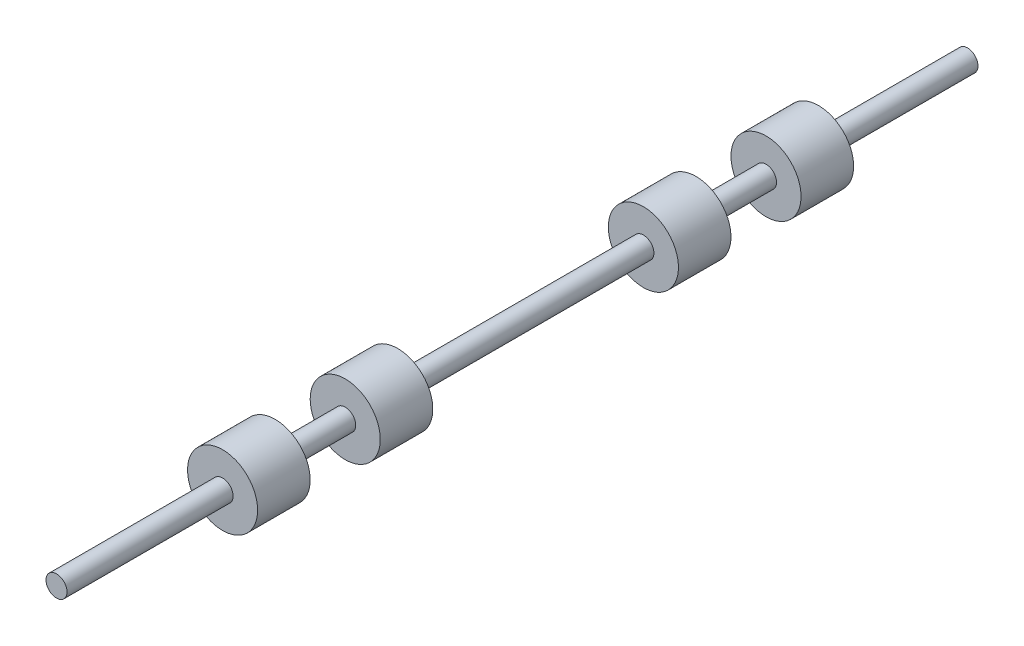
ISO-10303-21;
HEADER;
FILE_DESCRIPTION(('STEP AP214'),'2;1');
FILE_NAME('part.step','',(''),(''),'','','');
FILE_SCHEMA(('AUTOMOTIVE_DESIGN { 1 0 10303 214 1 1 1 1 }'));
ENDSEC;
DATA;
#1=APPLICATION_CONTEXT('core data for automotive mechanical design processes');
#2=APPLICATION_PROTOCOL_DEFINITION('international standard','automotive_design',2000,#1);
#3=PRODUCT_CONTEXT('',#1,'mechanical');
#4=PRODUCT('Part','Part','',(#3));
#5=PRODUCT_RELATED_PRODUCT_CATEGORY('part','',(#4));
#6=PRODUCT_DEFINITION_FORMATION('','',#4);
#7=PRODUCT_DEFINITION_CONTEXT('part definition',#1,'design');
#8=PRODUCT_DEFINITION('design','',#6,#7);
#9=PRODUCT_DEFINITION_SHAPE('','',#8);
#10=(LENGTH_UNIT() NAMED_UNIT(*) SI_UNIT(.MILLI.,.METRE.));
#11=(NAMED_UNIT(*) PLANE_ANGLE_UNIT() SI_UNIT($,.RADIAN.));
#12=(NAMED_UNIT(*) SI_UNIT($,.STERADIAN.) SOLID_ANGLE_UNIT());
#13=UNCERTAINTY_MEASURE_WITH_UNIT(LENGTH_MEASURE(1.E-05),#10,'distance_accuracy_value','');
#14=(GEOMETRIC_REPRESENTATION_CONTEXT(3) GLOBAL_UNCERTAINTY_ASSIGNED_CONTEXT((#13)) GLOBAL_UNIT_ASSIGNED_CONTEXT((#10,
#11,#12)) REPRESENTATION_CONTEXT('',''));
#15=CARTESIAN_POINT('',(0.,0.,0.));
#16=DIRECTION('',(0.,0.,1.));
#17=DIRECTION('',(1.,0.,0.));
#18=AXIS2_PLACEMENT_3D('',#15,#16,#17);
#19=CARTESIAN_POINT('',(0.,0.,26.));
#20=DIRECTION('',(0.,0.,-1.));
#21=DIRECTION('',(-1.,0.,0.));
#22=AXIS2_PLACEMENT_3D('',#19,#20,#21);
#23=CYLINDRICAL_SURFACE('',#22,0.3);
#24=CARTESIAN_POINT('',(0.,0.,17.76));
#25=DIRECTION('',(0.,0.,-1.));
#26=DIRECTION('',(-1.,0.,0.));
#27=AXIS2_PLACEMENT_3D('',#24,#25,#26);
#28=CIRCLE('',#27,0.3);
#29=CARTESIAN_POINT('',(-0.3,0.,17.76));
#30=VERTEX_POINT('',#29);
#31=EDGE_CURVE('E44',#30,#30,#28,.T.);
#32=ORIENTED_EDGE('',*,*,#31,.F.);
#33=EDGE_LOOP('',(#32));
#34=FACE_BOUND('',#33,.T.);
#35=CARTESIAN_POINT('',(0.,0.,19.76));
#36=DIRECTION('',(0.,0.,1.));
#37=DIRECTION('',(1.,0.,0.));
#38=AXIS2_PLACEMENT_3D('',#35,#36,#37);
#39=CIRCLE('',#38,0.3);
#40=CARTESIAN_POINT('',(0.3,0.,19.76));
#41=VERTEX_POINT('',#40);
#42=EDGE_CURVE('E40',#41,#41,#39,.T.);
#43=ORIENTED_EDGE('',*,*,#42,.F.);
#44=EDGE_LOOP('',(#43));
#45=FACE_BOUND('',#44,.T.);
#46=ADVANCED_FACE('F33',(#34,#45),#23,.T.);
#47=CARTESIAN_POINT('',(0.,0.,9.25));
#48=DIRECTION('',(0.,0.,-1.));
#49=DIRECTION('',(-1.,0.,0.));
#50=AXIS2_PLACEMENT_3D('',#47,#48,#49);
#51=CIRCLE('',#50,0.3);
#52=CARTESIAN_POINT('',(-0.3,0.,9.25));
#53=VERTEX_POINT('',#52);
#54=EDGE_CURVE('E53',#53,#53,#51,.T.);
#55=ORIENTED_EDGE('',*,*,#54,.F.);
#56=EDGE_LOOP('',(#55));
#57=FACE_BOUND('',#56,.T.);
#58=CARTESIAN_POINT('',(0.,0.,16.26));
#59=DIRECTION('',(0.,0.,1.));
#60=DIRECTION('',(1.,0.,0.));
#61=AXIS2_PLACEMENT_3D('',#58,#59,#60);
#62=CIRCLE('',#61,0.3);
#63=CARTESIAN_POINT('',(0.3,0.,16.26));
#64=VERTEX_POINT('',#63);
#65=EDGE_CURVE('E48',#64,#64,#62,.T.);
#66=ORIENTED_EDGE('',*,*,#65,.F.);
#67=EDGE_LOOP('',(#66));
#68=FACE_BOUND('',#67,.T.);
#69=ADVANCED_FACE('F115',(#57,#68),#23,.T.);
#70=CARTESIAN_POINT('',(0.,0.,5.75));
#71=DIRECTION('',(0.,0.,-1.));
#72=DIRECTION('',(-1.,0.,0.));
#73=AXIS2_PLACEMENT_3D('',#70,#71,#72);
#74=CIRCLE('',#73,0.3);
#75=CARTESIAN_POINT('',(-0.3,0.,5.75));
#76=VERTEX_POINT('',#75);
#77=EDGE_CURVE('E59',#76,#76,#74,.T.);
#78=ORIENTED_EDGE('',*,*,#77,.F.);
#79=EDGE_LOOP('',(#78));
#80=FACE_BOUND('',#79,.T.);
#81=CARTESIAN_POINT('',(0.,0.,7.75));
#82=DIRECTION('',(0.,0.,1.));
#83=DIRECTION('',(1.,0.,0.));
#84=AXIS2_PLACEMENT_3D('',#81,#82,#83);
#85=CIRCLE('',#84,0.3);
#86=CARTESIAN_POINT('',(0.3,0.,7.75));
#87=VERTEX_POINT('',#86);
#88=EDGE_CURVE('E56',#87,#87,#85,.T.);
#89=ORIENTED_EDGE('',*,*,#88,.F.);
#90=EDGE_LOOP('',(#89));
#91=FACE_BOUND('',#90,.T.);
#92=ADVANCED_FACE('F120',(#80,#91),#23,.T.);
#93=CARTESIAN_POINT('',(0.,0.,5.75));
#94=DIRECTION('',(0.,0.,-1.));
#95=DIRECTION('',(-1.,0.,0.));
#96=AXIS2_PLACEMENT_3D('',#93,#94,#95);
#97=PLANE('',#96);
#98=ORIENTED_EDGE('',*,*,#77,.T.);
#99=EDGE_LOOP('',(#98));
#100=FACE_BOUND('',#99,.T.);
#101=CARTESIAN_POINT('',(0.,0.,5.75));
#102=DIRECTION('',(0.,0.,-1.));
#103=DIRECTION('',(-1.,0.,0.));
#104=AXIS2_PLACEMENT_3D('',#101,#102,#103);
#105=CIRCLE('',#104,1.);
#106=CARTESIAN_POINT('',(-1.,0.,5.75));
#107=VERTEX_POINT('',#106);
#108=EDGE_CURVE('E69',#107,#107,#105,.T.);
#109=ORIENTED_EDGE('',*,*,#108,.F.);
#110=EDGE_LOOP('',(#109));
#111=FACE_BOUND('',#110,.T.);
#112=ADVANCED_FACE('F150',(#100,#111),#97,.F.);
#113=CARTESIAN_POINT('',(0.,0.,-1.24955045451801));
#114=DIRECTION('',(0.,0.,-1.));
#115=DIRECTION('',(-1.,0.,0.));
#116=AXIS2_PLACEMENT_3D('',#113,#114,#115);
#117=CYLINDRICAL_SURFACE('',#116,1.);
#118=CARTESIAN_POINT('',(0.,0.,4.25));
#119=DIRECTION('',(0.,0.,-1.));
#120=DIRECTION('',(-1.,0.,0.));
#121=AXIS2_PLACEMENT_3D('',#118,#119,#120);
#122=CIRCLE('',#121,1.);
#123=CARTESIAN_POINT('',(-1.,0.,4.25));
#124=VERTEX_POINT('',#123);
#125=EDGE_CURVE('E74',#124,#124,#122,.T.);
#126=ORIENTED_EDGE('',*,*,#125,.F.);
#127=EDGE_LOOP('',(#126));
#128=FACE_BOUND('',#127,.T.);
#129=ORIENTED_EDGE('',*,*,#108,.T.);
#130=EDGE_LOOP('',(#129));
#131=FACE_BOUND('',#130,.T.);
#132=ADVANCED_FACE('F155',(#128,#131),#117,.T.);
#133=CARTESIAN_POINT('',(0.,0.,4.25));
#134=DIRECTION('',(0.,0.,1.));
#135=DIRECTION('',(1.,0.,0.));
#136=AXIS2_PLACEMENT_3D('',#133,#134,#135);
#137=PLANE('',#136);
#138=CARTESIAN_POINT('',(0.,0.,4.25));
#139=DIRECTION('',(0.,0.,1.));
#140=DIRECTION('',(1.,0.,0.));
#141=AXIS2_PLACEMENT_3D('',#138,#139,#140);
#142=CIRCLE('',#141,0.3);
#143=CARTESIAN_POINT('',(0.3,0.,4.25));
#144=VERTEX_POINT('',#143);
#145=EDGE_CURVE('E62',#144,#144,#142,.T.);
#146=ORIENTED_EDGE('',*,*,#145,.T.);
#147=EDGE_LOOP('',(#146));
#148=FACE_BOUND('',#147,.T.);
#149=ORIENTED_EDGE('',*,*,#125,.T.);
#150=EDGE_LOOP('',(#149));
#151=FACE_BOUND('',#150,.T.);
#152=ADVANCED_FACE('F146',(#148,#151),#137,.F.);
#153=CARTESIAN_POINT('',(0.,0.,0.));
#154=DIRECTION('',(0.,0.,1.));
#155=DIRECTION('',(1.,0.,0.));
#156=AXIS2_PLACEMENT_3D('',#153,#154,#155);
#157=PLANE('',#156);
#158=CARTESIAN_POINT('',(0.,0.,0.));
#159=DIRECTION('',(0.,0.,1.));
#160=DIRECTION('',(1.,0.,0.));
#161=AXIS2_PLACEMENT_3D('',#158,#159,#160);
#162=CIRCLE('',#161,0.3);
#163=CARTESIAN_POINT('',(0.3,0.,0.));
#164=VERTEX_POINT('',#163);
#165=EDGE_CURVE('E66',#164,#164,#162,.T.);
#166=ORIENTED_EDGE('',*,*,#165,.F.);
#167=EDGE_LOOP('',(#166));
#168=FACE_BOUND('',#167,.T.);
#169=ADVANCED_FACE('F137',(#168),#157,.F.);
#170=ORIENTED_EDGE('',*,*,#165,.T.);
#171=EDGE_LOOP('',(#170));
#172=FACE_BOUND('',#171,.T.);
#173=ORIENTED_EDGE('',*,*,#145,.F.);
#174=EDGE_LOOP('',(#173));
#175=FACE_BOUND('',#174,.T.);
#176=ADVANCED_FACE('F127',(#172,#175),#23,.T.);
#177=CARTESIAN_POINT('',(0.,0.,9.25));
#178=DIRECTION('',(0.,0.,-1.));
#179=DIRECTION('',(-1.,0.,0.));
#180=AXIS2_PLACEMENT_3D('',#177,#178,#179);
#181=PLANE('',#180);
#182=ORIENTED_EDGE('',*,*,#54,.T.);
#183=EDGE_LOOP('',(#182));
#184=FACE_BOUND('',#183,.T.);
#185=CARTESIAN_POINT('',(0.,0.,9.25));
#186=DIRECTION('',(0.,0.,-1.));
#187=DIRECTION('',(-1.,0.,0.));
#188=AXIS2_PLACEMENT_3D('',#185,#186,#187);
#189=CIRCLE('',#188,1.);
#190=CARTESIAN_POINT('',(-1.,0.,9.25));
#191=VERTEX_POINT('',#190);
#192=EDGE_CURVE('E77',#191,#191,#189,.T.);
#193=ORIENTED_EDGE('',*,*,#192,.F.);
#194=EDGE_LOOP('',(#193));
#195=FACE_BOUND('',#194,.T.);
#196=ADVANCED_FACE('F136',(#184,#195),#181,.F.);
#197=CARTESIAN_POINT('',(0.,0.,-1.24955045451801));
#198=DIRECTION('',(0.,0.,-1.));
#199=DIRECTION('',(-1.,0.,0.));
#200=AXIS2_PLACEMENT_3D('',#197,#198,#199);
#201=CYLINDRICAL_SURFACE('',#200,1.);
#202=CARTESIAN_POINT('',(0.,0.,7.75));
#203=DIRECTION('',(0.,0.,-1.));
#204=DIRECTION('',(-1.,0.,0.));
#205=AXIS2_PLACEMENT_3D('',#202,#203,#204);
#206=CIRCLE('',#205,1.);
#207=CARTESIAN_POINT('',(-1.,0.,7.75));
#208=VERTEX_POINT('',#207);
#209=EDGE_CURVE('E80',#208,#208,#206,.T.);
#210=ORIENTED_EDGE('',*,*,#209,.F.);
#211=EDGE_LOOP('',(#210));
#212=FACE_BOUND('',#211,.T.);
#213=ORIENTED_EDGE('',*,*,#192,.T.);
#214=EDGE_LOOP('',(#213));
#215=FACE_BOUND('',#214,.T.);
#216=ADVANCED_FACE('F143',(#212,#215),#201,.T.);
#217=CARTESIAN_POINT('',(0.,0.,7.75));
#218=DIRECTION('',(0.,0.,1.));
#219=DIRECTION('',(1.,0.,0.));
#220=AXIS2_PLACEMENT_3D('',#217,#218,#219);
#221=PLANE('',#220);
#222=ORIENTED_EDGE('',*,*,#88,.T.);
#223=EDGE_LOOP('',(#222));
#224=FACE_BOUND('',#223,.T.);
#225=ORIENTED_EDGE('',*,*,#209,.T.);
#226=EDGE_LOOP('',(#225));
#227=FACE_BOUND('',#226,.T.);
#228=ADVANCED_FACE('F162',(#224,#227),#221,.F.);
#229=CARTESIAN_POINT('',(0.,0.,17.76));
#230=DIRECTION('',(0.,0.,-1.));
#231=DIRECTION('',(-1.,0.,0.));
#232=AXIS2_PLACEMENT_3D('',#229,#230,#231);
#233=PLANE('',#232);
#234=ORIENTED_EDGE('',*,*,#31,.T.);
#235=EDGE_LOOP('',(#234));
#236=FACE_BOUND('',#235,.T.);
#237=CARTESIAN_POINT('',(0.,0.,17.76));
#238=DIRECTION('',(0.,0.,-1.));
#239=DIRECTION('',(-1.,0.,0.));
#240=AXIS2_PLACEMENT_3D('',#237,#238,#239);
#241=CIRCLE('',#240,1.);
#242=CARTESIAN_POINT('',(-1.,0.,17.76));
#243=VERTEX_POINT('',#242);
#244=EDGE_CURVE('E83',#243,#243,#241,.T.);
#245=ORIENTED_EDGE('',*,*,#244,.F.);
#246=EDGE_LOOP('',(#245));
#247=FACE_BOUND('',#246,.T.);
#248=ADVANCED_FACE('F165',(#236,#247),#233,.F.);
#249=CARTESIAN_POINT('',(0.,0.,-1.24955045451801));
#250=DIRECTION('',(0.,0.,-1.));
#251=DIRECTION('',(-1.,0.,0.));
#252=AXIS2_PLACEMENT_3D('',#249,#250,#251);
#253=CYLINDRICAL_SURFACE('',#252,1.);
#254=CARTESIAN_POINT('',(0.,0.,16.26));
#255=DIRECTION('',(0.,0.,-1.));
#256=DIRECTION('',(-1.,0.,0.));
#257=AXIS2_PLACEMENT_3D('',#254,#255,#256);
#258=CIRCLE('',#257,1.);
#259=CARTESIAN_POINT('',(-1.,0.,16.26));
#260=VERTEX_POINT('',#259);
#261=EDGE_CURVE('E86',#260,#260,#258,.T.);
#262=ORIENTED_EDGE('',*,*,#261,.F.);
#263=EDGE_LOOP('',(#262));
#264=FACE_BOUND('',#263,.T.);
#265=ORIENTED_EDGE('',*,*,#244,.T.);
#266=EDGE_LOOP('',(#265));
#267=FACE_BOUND('',#266,.T.);
#268=ADVANCED_FACE('F111',(#264,#267),#253,.T.);
#269=CARTESIAN_POINT('',(0.,0.,16.26));
#270=DIRECTION('',(0.,0.,1.));
#271=DIRECTION('',(1.,0.,0.));
#272=AXIS2_PLACEMENT_3D('',#269,#270,#271);
#273=PLANE('',#272);
#274=ORIENTED_EDGE('',*,*,#65,.T.);
#275=EDGE_LOOP('',(#274));
#276=FACE_BOUND('',#275,.T.);
#277=ORIENTED_EDGE('',*,*,#261,.T.);
#278=EDGE_LOOP('',(#277));
#279=FACE_BOUND('',#278,.T.);
#280=ADVANCED_FACE('F106',(#276,#279),#273,.F.);
#281=CARTESIAN_POINT('',(0.,0.,21.26));
#282=DIRECTION('',(0.,0.,-1.));
#283=DIRECTION('',(-1.,0.,0.));
#284=AXIS2_PLACEMENT_3D('',#281,#282,#283);
#285=PLANE('',#284);
#286=CARTESIAN_POINT('',(0.,0.,21.26));
#287=DIRECTION('',(0.,0.,-1.));
#288=DIRECTION('',(-1.,0.,0.));
#289=AXIS2_PLACEMENT_3D('',#286,#287,#288);
#290=CIRCLE('',#289,0.3);
#291=CARTESIAN_POINT('',(-0.3,0.,21.26));
#292=VERTEX_POINT('',#291);
#293=EDGE_CURVE('E10',#292,#292,#290,.T.);
#294=ORIENTED_EDGE('',*,*,#293,.T.);
#295=EDGE_LOOP('',(#294));
#296=FACE_BOUND('',#295,.T.);
#297=CARTESIAN_POINT('',(0.,0.,21.26));
#298=DIRECTION('',(0.,0.,-1.));
#299=DIRECTION('',(-1.,0.,0.));
#300=AXIS2_PLACEMENT_3D('',#297,#298,#299);
#301=CIRCLE('',#300,1.);
#302=CARTESIAN_POINT('',(-1.,0.,21.26));
#303=VERTEX_POINT('',#302);
#304=EDGE_CURVE('E89',#303,#303,#301,.T.);
#305=ORIENTED_EDGE('',*,*,#304,.F.);
#306=EDGE_LOOP('',(#305));
#307=FACE_BOUND('',#306,.T.);
#308=ADVANCED_FACE('F101',(#296,#307),#285,.F.);
#309=CARTESIAN_POINT('',(0.,0.,-1.24955045451801));
#310=DIRECTION('',(0.,0.,-1.));
#311=DIRECTION('',(-1.,0.,0.));
#312=AXIS2_PLACEMENT_3D('',#309,#310,#311);
#313=CYLINDRICAL_SURFACE('',#312,1.);
#314=CARTESIAN_POINT('',(0.,0.,19.76));
#315=DIRECTION('',(0.,0.,-1.));
#316=DIRECTION('',(-1.,0.,0.));
#317=AXIS2_PLACEMENT_3D('',#314,#315,#316);
#318=CIRCLE('',#317,1.);
#319=CARTESIAN_POINT('',(-1.,0.,19.76));
#320=VERTEX_POINT('',#319);
#321=EDGE_CURVE('E92',#320,#320,#318,.T.);
#322=ORIENTED_EDGE('',*,*,#321,.F.);
#323=EDGE_LOOP('',(#322));
#324=FACE_BOUND('',#323,.T.);
#325=ORIENTED_EDGE('',*,*,#304,.T.);
#326=EDGE_LOOP('',(#325));
#327=FACE_BOUND('',#326,.T.);
#328=ADVANCED_FACE('F98',(#324,#327),#313,.T.);
#329=CARTESIAN_POINT('',(0.,0.,19.76));
#330=DIRECTION('',(0.,0.,1.));
#331=DIRECTION('',(1.,0.,0.));
#332=AXIS2_PLACEMENT_3D('',#329,#330,#331);
#333=PLANE('',#332);
#334=ORIENTED_EDGE('',*,*,#42,.T.);
#335=EDGE_LOOP('',(#334));
#336=FACE_BOUND('',#335,.T.);
#337=ORIENTED_EDGE('',*,*,#321,.T.);
#338=EDGE_LOOP('',(#337));
#339=FACE_BOUND('',#338,.T.);
#340=ADVANCED_FACE('F96',(#336,#339),#333,.F.);
#341=CARTESIAN_POINT('',(0.,0.,26.));
#342=DIRECTION('',(0.,0.,1.));
#343=DIRECTION('',(1.,0.,0.));
#344=AXIS2_PLACEMENT_3D('',#341,#342,#343);
#345=PLANE('',#344);
#346=CARTESIAN_POINT('',(0.,0.,26.));
#347=DIRECTION('',(0.,0.,1.));
#348=DIRECTION('',(1.,0.,0.));
#349=AXIS2_PLACEMENT_3D('',#346,#347,#348);
#350=CIRCLE('',#349,0.3);
#351=CARTESIAN_POINT('',(0.3,0.,26.));
#352=VERTEX_POINT('',#351);
#353=EDGE_CURVE('E65',#352,#352,#350,.T.);
#354=ORIENTED_EDGE('',*,*,#353,.T.);
#355=EDGE_LOOP('',(#354));
#356=FACE_BOUND('',#355,.T.);
#357=ADVANCED_FACE('F125',(#356),#345,.T.);
#358=ORIENTED_EDGE('',*,*,#353,.F.);
#359=EDGE_LOOP('',(#358));
#360=FACE_BOUND('',#359,.T.);
#361=ORIENTED_EDGE('',*,*,#293,.F.);
#362=EDGE_LOOP('',(#361));
#363=FACE_BOUND('',#362,.T.);
#364=ADVANCED_FACE('F35',(#360,#363),#23,.T.);
#365=CLOSED_SHELL('',(#46,#69,#92,#112,#132,#152,#169,#176,#196,#216,#228,#248,#268,#280,#308,
#328,#340,#357,#364));
#366=MANIFOLD_SOLID_BREP('B2',#365);
#367=ADVANCED_BREP_SHAPE_REPRESENTATION('',(#18,#366),#14);
#368=SHAPE_DEFINITION_REPRESENTATION(#9,#367);
ENDSEC;
END-ISO-10303-21;
